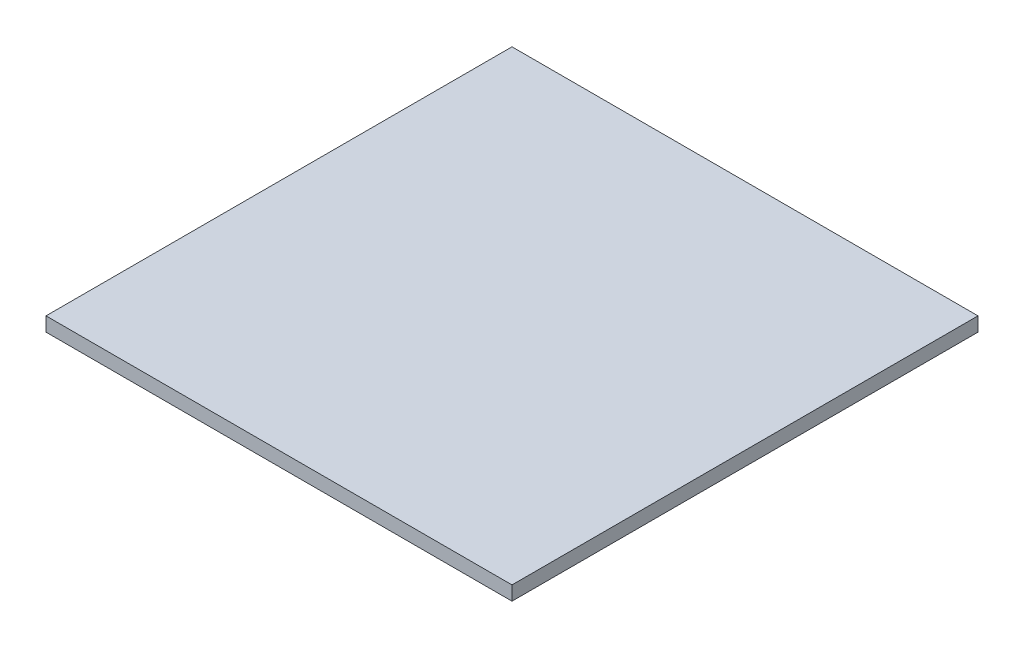
ISO-10303-21;
HEADER;
FILE_DESCRIPTION(('STEP AP214'),'2;1');
FILE_NAME('part.step','',(''),(''),'','','');
FILE_SCHEMA(('AUTOMOTIVE_DESIGN { 1 0 10303 214 1 1 1 1 }'));
ENDSEC;
DATA;
#1=APPLICATION_CONTEXT('core data for automotive mechanical design processes');
#2=APPLICATION_PROTOCOL_DEFINITION('international standard','automotive_design',2000,#1);
#3=PRODUCT_CONTEXT('',#1,'mechanical');
#4=PRODUCT('Part','Part','',(#3));
#5=PRODUCT_RELATED_PRODUCT_CATEGORY('part','',(#4));
#6=PRODUCT_DEFINITION_FORMATION('','',#4);
#7=PRODUCT_DEFINITION_CONTEXT('part definition',#1,'design');
#8=PRODUCT_DEFINITION('design','',#6,#7);
#9=PRODUCT_DEFINITION_SHAPE('','',#8);
#10=(LENGTH_UNIT() NAMED_UNIT(*) SI_UNIT(.MILLI.,.METRE.));
#11=(NAMED_UNIT(*) PLANE_ANGLE_UNIT() SI_UNIT($,.RADIAN.));
#12=(NAMED_UNIT(*) SI_UNIT($,.STERADIAN.) SOLID_ANGLE_UNIT());
#13=UNCERTAINTY_MEASURE_WITH_UNIT(LENGTH_MEASURE(1.E-05),#10,'distance_accuracy_value','');
#14=(GEOMETRIC_REPRESENTATION_CONTEXT(3) GLOBAL_UNCERTAINTY_ASSIGNED_CONTEXT((#13)) GLOBAL_UNIT_ASSIGNED_CONTEXT((#10,
#11,#12)) REPRESENTATION_CONTEXT('',''));
#15=CARTESIAN_POINT('',(0.,0.,0.));
#16=DIRECTION('',(0.,0.,1.));
#17=DIRECTION('',(1.,0.,0.));
#18=AXIS2_PLACEMENT_3D('',#15,#16,#17);
#19=CARTESIAN_POINT('',(165.,10.,165.));
#20=DIRECTION('',(-1.,0.,0.));
#21=DIRECTION('',(0.,0.,1.));
#22=AXIS2_PLACEMENT_3D('',#19,#20,#21);
#23=PLANE('',#22);
#24=DIRECTION('',(0.,0.,-1.));
#25=VECTOR('',#24,1.);
#26=CARTESIAN_POINT('',(165.,0.,165.));
#27=LINE('',#26,#25);
#28=CARTESIAN_POINT('',(165.,0.,165.));
#29=VERTEX_POINT('',#28);
#30=CARTESIAN_POINT('',(165.,0.,-165.));
#31=VERTEX_POINT('',#30);
#32=EDGE_CURVE('E96',#29,#31,#27,.T.);
#33=ORIENTED_EDGE('',*,*,#32,.T.);
#34=DIRECTION('',(0.,-1.,0.));
#35=VECTOR('',#34,1.);
#36=CARTESIAN_POINT('',(165.,10.,-165.));
#37=LINE('',#36,#35);
#38=CARTESIAN_POINT('',(165.,10.,-165.));
#39=VERTEX_POINT('',#38);
#40=EDGE_CURVE('E11',#39,#31,#37,.T.);
#41=ORIENTED_EDGE('',*,*,#40,.F.);
#42=DIRECTION('',(0.,0.,-1.));
#43=VECTOR('',#42,1.);
#44=CARTESIAN_POINT('',(165.,10.,165.));
#45=LINE('',#44,#43);
#46=CARTESIAN_POINT('',(165.,10.,165.));
#47=VERTEX_POINT('',#46);
#48=EDGE_CURVE('E84',#47,#39,#45,.T.);
#49=ORIENTED_EDGE('',*,*,#48,.F.);
#50=DIRECTION('',(0.,-1.,0.));
#51=VECTOR('',#50,1.);
#52=CARTESIAN_POINT('',(165.,10.,165.));
#53=LINE('',#52,#51);
#54=EDGE_CURVE('E92',#47,#29,#53,.T.);
#55=ORIENTED_EDGE('',*,*,#54,.T.);
#56=EDGE_LOOP('',(#33,#41,#49,#55));
#57=FACE_BOUND('',#56,.T.);
#58=ADVANCED_FACE('F33',(#57),#23,.F.);
#59=CARTESIAN_POINT('',(-165.,10.,-165.));
#60=DIRECTION('',(0.,0.,1.));
#61=DIRECTION('',(1.,0.,0.));
#62=AXIS2_PLACEMENT_3D('',#59,#60,#61);
#63=PLANE('',#62);
#64=DIRECTION('',(-1.,0.,0.));
#65=VECTOR('',#64,1.);
#66=CARTESIAN_POINT('',(-165.,0.,-165.));
#67=LINE('',#66,#65);
#68=CARTESIAN_POINT('',(-165.,0.,-165.));
#69=VERTEX_POINT('',#68);
#70=EDGE_CURVE('E88',#31,#69,#67,.T.);
#71=ORIENTED_EDGE('',*,*,#70,.T.);
#72=DIRECTION('',(0.,-1.,0.));
#73=VECTOR('',#72,1.);
#74=CARTESIAN_POINT('',(-165.,10.,-165.));
#75=LINE('',#74,#73);
#76=CARTESIAN_POINT('',(-165.,10.,-165.));
#77=VERTEX_POINT('',#76);
#78=EDGE_CURVE('E41',#77,#69,#75,.T.);
#79=ORIENTED_EDGE('',*,*,#78,.F.);
#80=DIRECTION('',(-1.,0.,0.));
#81=VECTOR('',#80,1.);
#82=CARTESIAN_POINT('',(-165.,10.,-165.));
#83=LINE('',#82,#81);
#84=EDGE_CURVE('E79',#39,#77,#83,.T.);
#85=ORIENTED_EDGE('',*,*,#84,.F.);
#86=ORIENTED_EDGE('',*,*,#40,.T.);
#87=EDGE_LOOP('',(#71,#79,#85,#86));
#88=FACE_BOUND('',#87,.T.);
#89=ADVANCED_FACE('F87',(#88),#63,.F.);
#90=CARTESIAN_POINT('',(-165.,10.,165.));
#91=DIRECTION('',(1.,0.,0.));
#92=DIRECTION('',(0.,0.,-1.));
#93=AXIS2_PLACEMENT_3D('',#90,#91,#92);
#94=PLANE('',#93);
#95=DIRECTION('',(0.,0.,1.));
#96=VECTOR('',#95,1.);
#97=CARTESIAN_POINT('',(-165.,0.,165.));
#98=LINE('',#97,#96);
#99=CARTESIAN_POINT('',(-165.,0.,165.));
#100=VERTEX_POINT('',#99);
#101=EDGE_CURVE('E66',#69,#100,#98,.T.);
#102=ORIENTED_EDGE('',*,*,#101,.T.);
#103=DIRECTION('',(0.,-1.,0.));
#104=VECTOR('',#103,1.);
#105=CARTESIAN_POINT('',(-165.,10.,165.));
#106=LINE('',#105,#104);
#107=CARTESIAN_POINT('',(-165.,10.,165.));
#108=VERTEX_POINT('',#107);
#109=EDGE_CURVE('E89',#108,#100,#106,.T.);
#110=ORIENTED_EDGE('',*,*,#109,.F.);
#111=DIRECTION('',(0.,0.,1.));
#112=VECTOR('',#111,1.);
#113=CARTESIAN_POINT('',(-165.,10.,165.));
#114=LINE('',#113,#112);
#115=EDGE_CURVE('E82',#77,#108,#114,.T.);
#116=ORIENTED_EDGE('',*,*,#115,.F.);
#117=ORIENTED_EDGE('',*,*,#78,.T.);
#118=EDGE_LOOP('',(#102,#110,#116,#117));
#119=FACE_BOUND('',#118,.T.);
#120=ADVANCED_FACE('F90',(#119),#94,.F.);
#121=CARTESIAN_POINT('',(-165.,10.,165.));
#122=DIRECTION('',(0.,0.,-1.));
#123=DIRECTION('',(-1.,0.,0.));
#124=AXIS2_PLACEMENT_3D('',#121,#122,#123);
#125=PLANE('',#124);
#126=DIRECTION('',(1.,0.,0.));
#127=VECTOR('',#126,1.);
#128=CARTESIAN_POINT('',(-165.,0.,165.));
#129=LINE('',#128,#127);
#130=EDGE_CURVE('E72',#100,#29,#129,.T.);
#131=ORIENTED_EDGE('',*,*,#130,.T.);
#132=ORIENTED_EDGE('',*,*,#54,.F.);
#133=DIRECTION('',(1.,0.,0.));
#134=VECTOR('',#133,1.);
#135=CARTESIAN_POINT('',(-165.,10.,165.));
#136=LINE('',#135,#134);
#137=EDGE_CURVE('E49',#108,#47,#136,.T.);
#138=ORIENTED_EDGE('',*,*,#137,.F.);
#139=ORIENTED_EDGE('',*,*,#109,.T.);
#140=EDGE_LOOP('',(#131,#132,#138,#139));
#141=FACE_BOUND('',#140,.T.);
#142=ADVANCED_FACE('F103',(#141),#125,.F.);
#143=CARTESIAN_POINT('',(0.,10.,0.));
#144=DIRECTION('',(0.,-1.,0.));
#145=DIRECTION('',(0.,0.,-1.));
#146=AXIS2_PLACEMENT_3D('',#143,#144,#145);
#147=PLANE('',#146);
#148=ORIENTED_EDGE('',*,*,#48,.T.);
#149=ORIENTED_EDGE('',*,*,#84,.T.);
#150=ORIENTED_EDGE('',*,*,#115,.T.);
#151=ORIENTED_EDGE('',*,*,#137,.T.);
#152=EDGE_LOOP('',(#148,#149,#150,#151));
#153=FACE_BOUND('',#152,.T.);
#154=ADVANCED_FACE('F80',(#153),#147,.F.);
#155=CARTESIAN_POINT('',(0.,0.,0.));
#156=DIRECTION('',(0.,-1.,0.));
#157=DIRECTION('',(0.,0.,-1.));
#158=AXIS2_PLACEMENT_3D('',#155,#156,#157);
#159=PLANE('',#158);
#160=ORIENTED_EDGE('',*,*,#32,.F.);
#161=ORIENTED_EDGE('',*,*,#130,.F.);
#162=ORIENTED_EDGE('',*,*,#101,.F.);
#163=ORIENTED_EDGE('',*,*,#70,.F.);
#164=EDGE_LOOP('',(#160,#161,#162,#163));
#165=FACE_BOUND('',#164,.T.);
#166=ADVANCED_FACE('F106',(#165),#159,.T.);
#167=CLOSED_SHELL('',(#58,#89,#120,#142,#154,#166));
#168=MANIFOLD_SOLID_BREP('B2',#167);
#169=ADVANCED_BREP_SHAPE_REPRESENTATION('',(#18,#168),#14);
#170=SHAPE_DEFINITION_REPRESENTATION(#9,#169);
ENDSEC;
END-ISO-10303-21;
